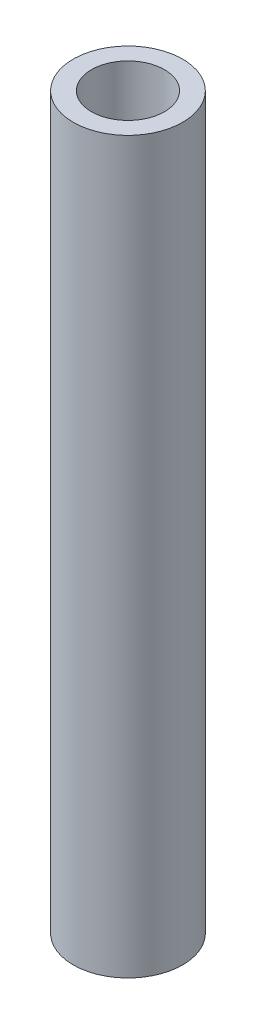
ISO-10303-21;
HEADER;
FILE_DESCRIPTION(('STEP AP214'),'2;1');
FILE_NAME('part.step','',(''),(''),'','','');
FILE_SCHEMA(('AUTOMOTIVE_DESIGN { 1 0 10303 214 1 1 1 1 }'));
ENDSEC;
DATA;
#1=APPLICATION_CONTEXT('core data for automotive mechanical design processes');
#2=APPLICATION_PROTOCOL_DEFINITION('international standard','automotive_design',2000,#1);
#3=PRODUCT_CONTEXT('',#1,'mechanical');
#4=PRODUCT('Part','Part','',(#3));
#5=PRODUCT_RELATED_PRODUCT_CATEGORY('part','',(#4));
#6=PRODUCT_DEFINITION_FORMATION('','',#4);
#7=PRODUCT_DEFINITION_CONTEXT('part definition',#1,'design');
#8=PRODUCT_DEFINITION('design','',#6,#7);
#9=PRODUCT_DEFINITION_SHAPE('','',#8);
#10=(LENGTH_UNIT() NAMED_UNIT(*) SI_UNIT(.MILLI.,.METRE.));
#11=(NAMED_UNIT(*) PLANE_ANGLE_UNIT() SI_UNIT($,.RADIAN.));
#12=(NAMED_UNIT(*) SI_UNIT($,.STERADIAN.) SOLID_ANGLE_UNIT());
#13=UNCERTAINTY_MEASURE_WITH_UNIT(LENGTH_MEASURE(1.E-05),#10,'distance_accuracy_value','');
#14=(GEOMETRIC_REPRESENTATION_CONTEXT(3) GLOBAL_UNCERTAINTY_ASSIGNED_CONTEXT((#13)) GLOBAL_UNIT_ASSIGNED_CONTEXT((#10,
#11,#12)) REPRESENTATION_CONTEXT('',''));
#15=CARTESIAN_POINT('',(0.,0.,0.));
#16=DIRECTION('',(0.,0.,1.));
#17=DIRECTION('',(1.,0.,0.));
#18=AXIS2_PLACEMENT_3D('',#15,#16,#17);
#19=CARTESIAN_POINT('',(0.,0.,0.));
#20=DIRECTION('',(0.,1.,0.));
#21=DIRECTION('',(0.,0.,1.));
#22=AXIS2_PLACEMENT_3D('',#19,#20,#21);
#23=CYLINDRICAL_SURFACE('',#22,7.5);
#24=CARTESIAN_POINT('',(0.,100.,0.));
#25=DIRECTION('',(0.,1.,0.));
#26=DIRECTION('',(0.,0.,1.));
#27=AXIS2_PLACEMENT_3D('',#24,#25,#26);
#28=CIRCLE('',#27,7.5);
#29=CARTESIAN_POINT('',(0.,100.,7.5));
#30=VERTEX_POINT('',#29);
#31=EDGE_CURVE('E43',#30,#30,#28,.T.);
#32=CARTESIAN_POINT('',(0.,0.,0.));
#33=DIRECTION('',(0.,1.,0.));
#34=DIRECTION('',(0.,0.,1.));
#35=AXIS2_PLACEMENT_3D('',#32,#33,#34);
#36=CIRCLE('',#35,7.5);
#37=CARTESIAN_POINT('',(0.,0.,7.5));
#38=VERTEX_POINT('',#37);
#39=EDGE_CURVE('E34',#38,#38,#36,.T.);
#40=CARTESIAN_POINT('',(0.,100.,7.5));
#41=CARTESIAN_POINT('',(0.,98.9583333333333,7.5));
#42=CARTESIAN_POINT('',(0.,97.9166666666667,7.5));
#43=CARTESIAN_POINT('',(0.,95.8333333333333,7.5));
#44=CARTESIAN_POINT('',(0.,94.7916666666666,7.5));
#45=CARTESIAN_POINT('',(0.,92.7083333333333,7.5));
#46=CARTESIAN_POINT('',(0.,91.6666666666667,7.5));
#47=CARTESIAN_POINT('',(0.,89.5833333333333,7.5));
#48=CARTESIAN_POINT('',(0.,88.5416666666667,7.5));
#49=CARTESIAN_POINT('',(0.,86.4583333333333,7.5));
#50=CARTESIAN_POINT('',(0.,85.4166666666667,7.5));
#51=CARTESIAN_POINT('',(0.,83.3333333333333,7.5));
#52=CARTESIAN_POINT('',(0.,82.2916666666667,7.5));
#53=CARTESIAN_POINT('',(0.,80.2083333333333,7.5));
#54=CARTESIAN_POINT('',(0.,79.1666666666666,7.5));
#55=CARTESIAN_POINT('',(0.,77.0833333333333,7.5));
#56=CARTESIAN_POINT('',(0.,76.0416666666667,7.5));
#57=CARTESIAN_POINT('',(0.,73.9583333333333,7.5));
#58=CARTESIAN_POINT('',(0.,72.9166666666667,7.5));
#59=CARTESIAN_POINT('',(0.,70.8333333333333,7.5));
#60=CARTESIAN_POINT('',(0.,69.7916666666667,7.5));
#61=CARTESIAN_POINT('',(0.,67.7083333333333,7.5));
#62=CARTESIAN_POINT('',(0.,66.6666666666667,7.5));
#63=CARTESIAN_POINT('',(0.,64.5833333333333,7.5));
#64=CARTESIAN_POINT('',(0.,63.5416666666667,7.5));
#65=CARTESIAN_POINT('',(0.,61.4583333333333,7.5));
#66=CARTESIAN_POINT('',(0.,60.4166666666667,7.5));
#67=CARTESIAN_POINT('',(0.,58.3333333333333,7.5));
#68=CARTESIAN_POINT('',(0.,57.2916666666667,7.5));
#69=CARTESIAN_POINT('',(0.,55.2083333333333,7.5));
#70=CARTESIAN_POINT('',(0.,54.1666666666667,7.5));
#71=CARTESIAN_POINT('',(0.,52.0833333333333,7.5));
#72=CARTESIAN_POINT('',(0.,51.0416666666667,7.5));
#73=CARTESIAN_POINT('',(0.,48.9583333333333,7.5));
#74=CARTESIAN_POINT('',(0.,47.9166666666667,7.5));
#75=CARTESIAN_POINT('',(0.,45.8333333333333,7.5));
#76=CARTESIAN_POINT('',(0.,44.7916666666667,7.5));
#77=CARTESIAN_POINT('',(0.,42.7083333333333,7.5));
#78=CARTESIAN_POINT('',(0.,41.6666666666667,7.5));
#79=CARTESIAN_POINT('',(0.,39.5833333333333,7.5));
#80=CARTESIAN_POINT('',(0.,38.5416666666667,7.5));
#81=CARTESIAN_POINT('',(0.,36.4583333333333,7.5));
#82=CARTESIAN_POINT('',(0.,35.4166666666667,7.5));
#83=CARTESIAN_POINT('',(0.,33.3333333333333,7.5));
#84=CARTESIAN_POINT('',(0.,32.2916666666667,7.5));
#85=CARTESIAN_POINT('',(0.,30.2083333333333,7.5));
#86=CARTESIAN_POINT('',(0.,29.1666666666667,7.5));
#87=CARTESIAN_POINT('',(0.,27.0833333333333,7.5));
#88=CARTESIAN_POINT('',(0.,26.0416666666667,7.5));
#89=CARTESIAN_POINT('',(0.,23.9583333333333,7.5));
#90=CARTESIAN_POINT('',(0.,22.9166666666667,7.5));
#91=CARTESIAN_POINT('',(0.,20.8333333333333,7.5));
#92=CARTESIAN_POINT('',(0.,19.7916666666667,7.5));
#93=CARTESIAN_POINT('',(0.,17.7083333333333,7.5));
#94=CARTESIAN_POINT('',(0.,16.6666666666667,7.5));
#95=CARTESIAN_POINT('',(0.,14.5833333333333,7.5));
#96=CARTESIAN_POINT('',(0.,13.5416666666667,7.5));
#97=CARTESIAN_POINT('',(0.,11.4583333333333,7.5));
#98=CARTESIAN_POINT('',(0.,10.4166666666667,7.5));
#99=CARTESIAN_POINT('',(0.,8.33333333333333,7.5));
#100=CARTESIAN_POINT('',(0.,7.29166666666667,7.5));
#101=CARTESIAN_POINT('',(0.,5.20833333333334,7.5));
#102=CARTESIAN_POINT('',(0.,4.16666666666667,7.5));
#103=CARTESIAN_POINT('',(0.,2.08333333333334,7.5));
#104=CARTESIAN_POINT('',(0.,1.04166666666667,7.5));
#105=CARTESIAN_POINT('',(0.,0.,7.5));
#106=B_SPLINE_CURVE_WITH_KNOTS('',3,(#40,#41,#42,#43,#44,#45,#46,#47,#48,#49,#50,#51,#52,#53,
#54,#55,#56,#57,#58,#59,#60,#61,#62,#63,#64,#65,#66,#67,#68,#69,#70,#71,#72,#73,#74,#75,#76,#77,
#78,#79,#80,#81,#82,#83,#84,#85,#86,#87,#88,#89,#90,#91,#92,#93,#94,#95,#96,#97,#98,#99,#100,
#101,#102,#103,#104,#105),.UNSPECIFIED.,.F.,.F.,(4,2,2,2,2,2,2,2,2,2,2,2,2,2,2,2,2,2,2,2,2,2,2,
2,2,2,2,2,2,2,2,2,4),(0.,3.125,6.25000000000001,9.37499999999999,12.5,15.625,18.75,21.875,25.,
28.125,31.25,34.375,37.5,40.625,43.75,46.875,50.,53.125,56.25,59.375,62.5,65.625,68.75,71.875,
75.,78.125,81.25,84.375,87.5,90.625,93.75,96.875,100.),.UNSPECIFIED.);
#107=EDGE_CURVE('BSEAM31',#30,#38,#106,.T.);
#108=ORIENTED_EDGE('',*,*,#31,.F.);
#109=ORIENTED_EDGE('',*,*,#39,.T.);
#110=ORIENTED_EDGE('',*,*,#107,.T.);
#111=ORIENTED_EDGE('',*,*,#107,.F.);
#112=EDGE_LOOP('',(#108,#110,#109,#111));
#113=FACE_BOUND('',#112,.T.);
#114=ADVANCED_FACE('F31',(#113),#23,.T.);
#115=CARTESIAN_POINT('',(0.,0.,0.));
#116=DIRECTION('',(0.,1.,0.));
#117=DIRECTION('',(0.,0.,1.));
#118=AXIS2_PLACEMENT_3D('',#115,#116,#117);
#119=PLANE('',#118);
#120=CARTESIAN_POINT('',(0.,0.,0.));
#121=DIRECTION('',(0.,1.,0.));
#122=DIRECTION('',(0.,0.,1.));
#123=AXIS2_PLACEMENT_3D('',#120,#121,#122);
#124=CIRCLE('',#123,5.);
#125=CARTESIAN_POINT('',(0.,0.,5.));
#126=VERTEX_POINT('',#125);
#127=EDGE_CURVE('E38',#126,#126,#124,.F.);
#128=ORIENTED_EDGE('',*,*,#127,.F.);
#129=EDGE_LOOP('',(#128));
#130=FACE_BOUND('',#129,.T.);
#131=ORIENTED_EDGE('',*,*,#39,.F.);
#132=EDGE_LOOP('',(#131));
#133=FACE_BOUND('',#132,.T.);
#134=ADVANCED_FACE('F52',(#130,#133),#119,.F.);
#135=CARTESIAN_POINT('',(0.,100.,0.));
#136=DIRECTION('',(0.,1.,0.));
#137=DIRECTION('',(0.,0.,1.));
#138=AXIS2_PLACEMENT_3D('',#135,#136,#137);
#139=PLANE('',#138);
#140=CARTESIAN_POINT('',(0.,100.,0.));
#141=DIRECTION('',(0.,1.,0.));
#142=DIRECTION('',(0.,0.,1.));
#143=AXIS2_PLACEMENT_3D('',#140,#141,#142);
#144=CIRCLE('',#143,5.);
#145=CARTESIAN_POINT('',(0.,100.,5.));
#146=VERTEX_POINT('',#145);
#147=EDGE_CURVE('E10',#146,#146,#144,.F.);
#148=ORIENTED_EDGE('',*,*,#147,.T.);
#149=EDGE_LOOP('',(#148));
#150=FACE_BOUND('',#149,.T.);
#151=ORIENTED_EDGE('',*,*,#31,.T.);
#152=EDGE_LOOP('',(#151));
#153=FACE_BOUND('',#152,.T.);
#154=ADVANCED_FACE('F54',(#150,#153),#139,.T.);
#155=CARTESIAN_POINT('',(0.,0.,0.));
#156=DIRECTION('',(0.,1.,0.));
#157=DIRECTION('',(0.,0.,1.));
#158=AXIS2_PLACEMENT_3D('',#155,#156,#157);
#159=CYLINDRICAL_SURFACE('',#158,5.);
#160=CARTESIAN_POINT('',(0.,100.,5.));
#161=CARTESIAN_POINT('',(0.,98.9583333333333,5.));
#162=CARTESIAN_POINT('',(0.,97.9166666666667,5.));
#163=CARTESIAN_POINT('',(0.,95.8333333333333,5.));
#164=CARTESIAN_POINT('',(0.,94.7916666666666,5.));
#165=CARTESIAN_POINT('',(0.,92.7083333333333,5.));
#166=CARTESIAN_POINT('',(0.,91.6666666666667,5.));
#167=CARTESIAN_POINT('',(0.,89.5833333333333,5.));
#168=CARTESIAN_POINT('',(0.,88.5416666666667,5.));
#169=CARTESIAN_POINT('',(0.,86.4583333333333,5.));
#170=CARTESIAN_POINT('',(0.,85.4166666666667,5.));
#171=CARTESIAN_POINT('',(0.,83.3333333333333,5.));
#172=CARTESIAN_POINT('',(0.,82.2916666666667,5.));
#173=CARTESIAN_POINT('',(0.,80.2083333333333,5.));
#174=CARTESIAN_POINT('',(0.,79.1666666666666,5.));
#175=CARTESIAN_POINT('',(0.,77.0833333333333,5.));
#176=CARTESIAN_POINT('',(0.,76.0416666666667,5.));
#177=CARTESIAN_POINT('',(0.,73.9583333333333,5.));
#178=CARTESIAN_POINT('',(0.,72.9166666666667,5.));
#179=CARTESIAN_POINT('',(0.,70.8333333333333,5.));
#180=CARTESIAN_POINT('',(0.,69.7916666666667,5.));
#181=CARTESIAN_POINT('',(0.,67.7083333333333,5.));
#182=CARTESIAN_POINT('',(0.,66.6666666666667,5.));
#183=CARTESIAN_POINT('',(0.,64.5833333333333,5.));
#184=CARTESIAN_POINT('',(0.,63.5416666666667,5.));
#185=CARTESIAN_POINT('',(0.,61.4583333333333,5.));
#186=CARTESIAN_POINT('',(0.,60.4166666666667,5.));
#187=CARTESIAN_POINT('',(0.,58.3333333333333,5.));
#188=CARTESIAN_POINT('',(0.,57.2916666666667,5.));
#189=CARTESIAN_POINT('',(0.,55.2083333333333,5.));
#190=CARTESIAN_POINT('',(0.,54.1666666666667,5.));
#191=CARTESIAN_POINT('',(0.,52.0833333333333,5.));
#192=CARTESIAN_POINT('',(0.,51.0416666666667,5.));
#193=CARTESIAN_POINT('',(0.,48.9583333333333,5.));
#194=CARTESIAN_POINT('',(0.,47.9166666666667,5.));
#195=CARTESIAN_POINT('',(0.,45.8333333333333,5.));
#196=CARTESIAN_POINT('',(0.,44.7916666666667,5.));
#197=CARTESIAN_POINT('',(0.,42.7083333333333,5.));
#198=CARTESIAN_POINT('',(0.,41.6666666666667,5.));
#199=CARTESIAN_POINT('',(0.,39.5833333333333,5.));
#200=CARTESIAN_POINT('',(0.,38.5416666666667,5.));
#201=CARTESIAN_POINT('',(0.,36.4583333333333,5.));
#202=CARTESIAN_POINT('',(0.,35.4166666666667,5.));
#203=CARTESIAN_POINT('',(0.,33.3333333333333,5.));
#204=CARTESIAN_POINT('',(0.,32.2916666666667,5.));
#205=CARTESIAN_POINT('',(0.,30.2083333333333,5.));
#206=CARTESIAN_POINT('',(0.,29.1666666666667,5.));
#207=CARTESIAN_POINT('',(0.,27.0833333333333,5.));
#208=CARTESIAN_POINT('',(0.,26.0416666666667,5.));
#209=CARTESIAN_POINT('',(0.,23.9583333333333,5.));
#210=CARTESIAN_POINT('',(0.,22.9166666666667,5.));
#211=CARTESIAN_POINT('',(0.,20.8333333333333,5.));
#212=CARTESIAN_POINT('',(0.,19.7916666666667,5.));
#213=CARTESIAN_POINT('',(0.,17.7083333333333,5.));
#214=CARTESIAN_POINT('',(0.,16.6666666666667,5.));
#215=CARTESIAN_POINT('',(0.,14.5833333333333,5.));
#216=CARTESIAN_POINT('',(0.,13.5416666666667,5.));
#217=CARTESIAN_POINT('',(0.,11.4583333333333,5.));
#218=CARTESIAN_POINT('',(0.,10.4166666666667,5.));
#219=CARTESIAN_POINT('',(0.,8.33333333333333,5.));
#220=CARTESIAN_POINT('',(0.,7.29166666666667,5.));
#221=CARTESIAN_POINT('',(0.,5.20833333333334,5.));
#222=CARTESIAN_POINT('',(0.,4.16666666666667,5.));
#223=CARTESIAN_POINT('',(0.,2.08333333333334,5.));
#224=CARTESIAN_POINT('',(0.,1.04166666666667,5.));
#225=CARTESIAN_POINT('',(0.,0.,5.));
#226=B_SPLINE_CURVE_WITH_KNOTS('',3,(#160,#161,#162,#163,#164,#165,#166,#167,#168,#169,#170,
#171,#172,#173,#174,#175,#176,#177,#178,#179,#180,#181,#182,#183,#184,#185,#186,#187,#188,#189,
#190,#191,#192,#193,#194,#195,#196,#197,#198,#199,#200,#201,#202,#203,#204,#205,#206,#207,#208,
#209,#210,#211,#212,#213,#214,#215,#216,#217,#218,#219,#220,#221,#222,#223,#224,#225),
.UNSPECIFIED.,.F.,.F.,(4,2,2,2,2,2,2,2,2,2,2,2,2,2,2,2,2,2,2,2,2,2,2,2,2,2,2,2,2,2,2,2,4),(0.,
3.125,6.25000000000001,9.37499999999999,12.5,15.625,18.75,21.875,25.,28.125,31.25,34.375,37.5,
40.625,43.75,46.875,50.,53.125,56.25,59.375,62.5,65.625,68.75,71.875,75.,78.125,81.25,84.375,
87.5,90.625,93.75,96.875,100.),.UNSPECIFIED.);
#227=EDGE_CURVE('BSEAM60',#146,#126,#226,.T.);
#228=ORIENTED_EDGE('',*,*,#147,.F.);
#229=ORIENTED_EDGE('',*,*,#127,.T.);
#230=ORIENTED_EDGE('',*,*,#227,.T.);
#231=ORIENTED_EDGE('',*,*,#227,.F.);
#232=EDGE_LOOP('',(#228,#230,#229,#231));
#233=FACE_BOUND('',#232,.T.);
#234=ADVANCED_FACE('F60',(#233),#159,.F.);
#235=CLOSED_SHELL('',(#114,#134,#154,#234));
#236=MANIFOLD_SOLID_BREP('B2',#235);
#237=ADVANCED_BREP_SHAPE_REPRESENTATION('',(#18,#236),#14);
#238=SHAPE_DEFINITION_REPRESENTATION(#9,#237);
ENDSEC;
END-ISO-10303-21;
